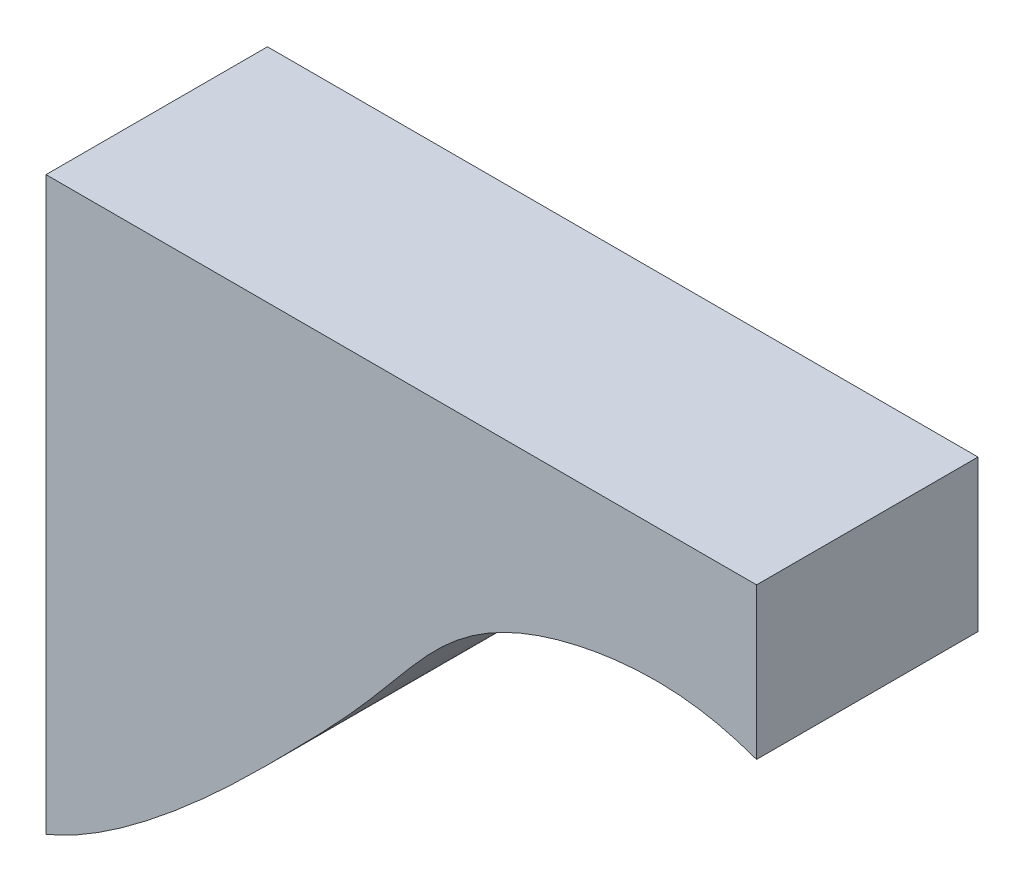
ISO-10303-21;
HEADER;
FILE_DESCRIPTION(('STEP AP214'),'2;1');
FILE_NAME('part.step','',(''),(''),'','','');
FILE_SCHEMA(('AUTOMOTIVE_DESIGN { 1 0 10303 214 1 1 1 1 }'));
ENDSEC;
DATA;
#1=APPLICATION_CONTEXT('core data for automotive mechanical design processes');
#2=APPLICATION_PROTOCOL_DEFINITION('international standard','automotive_design',2000,#1);
#3=PRODUCT_CONTEXT('',#1,'mechanical');
#4=PRODUCT('Part','Part','',(#3));
#5=PRODUCT_RELATED_PRODUCT_CATEGORY('part','',(#4));
#6=PRODUCT_DEFINITION_FORMATION('','',#4);
#7=PRODUCT_DEFINITION_CONTEXT('part definition',#1,'design');
#8=PRODUCT_DEFINITION('design','',#6,#7);
#9=PRODUCT_DEFINITION_SHAPE('','',#8);
#10=(LENGTH_UNIT() NAMED_UNIT(*) SI_UNIT(.MILLI.,.METRE.));
#11=(NAMED_UNIT(*) PLANE_ANGLE_UNIT() SI_UNIT($,.RADIAN.));
#12=(NAMED_UNIT(*) SI_UNIT($,.STERADIAN.) SOLID_ANGLE_UNIT());
#13=UNCERTAINTY_MEASURE_WITH_UNIT(LENGTH_MEASURE(1.E-05),#10,'distance_accuracy_value','');
#14=(GEOMETRIC_REPRESENTATION_CONTEXT(3) GLOBAL_UNCERTAINTY_ASSIGNED_CONTEXT((#13)) GLOBAL_UNIT_ASSIGNED_CONTEXT((#10,
#11,#12)) REPRESENTATION_CONTEXT('',''));
#15=CARTESIAN_POINT('',(0.,0.,0.));
#16=DIRECTION('',(0.,0.,1.));
#17=DIRECTION('',(1.,0.,0.));
#18=AXIS2_PLACEMENT_3D('',#15,#16,#17);
#19=CARTESIAN_POINT('',(64.176185141697,-18.3829097349194,43.9999999999997));
#20=CARTESIAN_POINT('',(64.7902113557796,-18.1318562835224,43.9999999999997));
#21=CARTESIAN_POINT('',(65.3647442195145,-17.8182072919949,43.9999999999997));
#22=CARTESIAN_POINT('',(66.4747387321708,-17.1289828384513,43.9999999999997));
#23=CARTESIAN_POINT('',(67.0092337850599,-16.7518753564826,43.9999999999997));
#24=CARTESIAN_POINT('',(68.054549012157,-15.9601365611778,43.9999999999997));
#25=CARTESIAN_POINT('',(68.5655852799204,-15.5448064595787,43.9999999999997));
#26=CARTESIAN_POINT('',(69.5644663706468,-14.6920847457634,43.9999999999997));
#27=CARTESIAN_POINT('',(70.0531920182059,-14.2539847533171,43.9999999999997));
#28=CARTESIAN_POINT('',(71.4936225253486,-12.9114772371004,43.9999999999997));
#29=CARTESIAN_POINT('',(72.4211412162654,-11.9799830777563,43.9999999999997));
#30=CARTESIAN_POINT('',(73.8008407584314,-10.5732349331057,43.9999999999997));
#31=CARTESIAN_POINT('',(74.2583298655235,-10.1020401053667,43.9999999999997));
#32=CARTESIAN_POINT('',(75.1542571840649,-9.14164237538519,43.9999999999997));
#33=CARTESIAN_POINT('',(75.5923051652214,-8.65209724582154,43.9999999999997));
#34=CARTESIAN_POINT('',(76.4443866195398,-7.65019723113076,43.9999999999997));
#35=CARTESIAN_POINT('',(76.8614369321452,-7.14041319839445,43.9999999999997));
#36=CARTESIAN_POINT('',(77.7187983722306,-6.14370132358863,43.9999999999997));
#37=CARTESIAN_POINT('',(78.1578073934243,-5.65549402550225,43.9999999999997));
#38=CARTESIAN_POINT('',(78.8879346189482,-4.99355104472038,43.9999999999997));
#39=CARTESIAN_POINT('',(79.1428855357567,-4.78427720809741,43.9999999999997));
#40=CARTESIAN_POINT('',(79.679491669474,-4.39196931097297,43.9999999999997));
#41=CARTESIAN_POINT('',(79.9625924755278,-4.20854443955359,43.9999999999997));
#42=CARTESIAN_POINT('',(80.8272197672929,-3.71404185928137,43.9999999999997));
#43=CARTESIAN_POINT('',(81.4311820616806,-3.45243817744652,43.9999999999997));
#44=CARTESIAN_POINT('',(82.3682035422714,-3.13683013825518,43.9999999999997));
#45=CARTESIAN_POINT('',(82.6856860031031,-3.04433386349374,43.9999999999997));
#46=CARTESIAN_POINT('',(83.3300745465412,-2.88262818989416,43.9999999999997));
#47=CARTESIAN_POINT('',(83.6574259546441,-2.81369011634486,43.9999999999997));
#48=CARTESIAN_POINT('',(84.63809497021,-2.64160519636283,43.9999999999997));
#49=CARTESIAN_POINT('',(85.2949649102728,-2.57100859864708,43.9999999999997));
#50=CARTESIAN_POINT('',(86.2861978967168,-2.54975314112215,43.9999999999997));
#51=CARTESIAN_POINT('',(86.6176058838011,-2.55690275973276,43.9999999999997));
#52=CARTESIAN_POINT('',(87.2826533441994,-2.60306254185672,43.9999999999997));
#53=CARTESIAN_POINT('',(87.615772059275,-2.64231877721083,43.9999999999997));
#54=CARTESIAN_POINT('',(88.5950207410823,-2.80727454987168,43.9999999999997));
#55=CARTESIAN_POINT('',(89.2283286747827,-2.98204316226857,43.9999999999997));
#56=CARTESIAN_POINT('',(89.846388359393,-3.20741775553682,43.9999999999997));
#57=B_SPLINE_CURVE_WITH_KNOTS('',3,(#19,#20,#21,#22,#23,#24,#25,#26,#27,#28,#29,#30,#31,#32,#33,
#34,#35,#36,#37,#38,#39,#40,#41,#42,#43,#44,#45,#46,#47,#48,#49,#50,#51,#52,#53,#54,#55,#56),
.UNSPECIFIED.,.F.,.F.,(4,2,2,2,2,2,2,2,2,2,2,2,2,2,2,2,2,2,4),(0.,0.0625000000000001,0.125,
0.1875,0.250000000000001,0.375,0.437499999999999,0.499999999999999,0.562499999999998,
0.624999999999998,0.656249999999997,0.687499999999996,0.749999999999995,0.781249999999994,
0.812499999999994,0.874999999999995,0.906249999999996,0.937499999999998,1.),.UNSPECIFIED.);
#58=DIRECTION('',(0.,0.,1.));
#59=VECTOR('',#58,1.);
#60=SURFACE_OF_LINEAR_EXTRUSION('',#57,#59);
#61=CARTESIAN_POINT('',(89.846388359393,-3.20741775553682,51.9999999999997));
#62=CARTESIAN_POINT('',(89.2283286747827,-2.98204316226857,51.9999999999997));
#63=CARTESIAN_POINT('',(88.5950207410823,-2.80727454987168,51.9999999999997));
#64=CARTESIAN_POINT('',(87.615772059275,-2.64231877721083,51.9999999999997));
#65=CARTESIAN_POINT('',(87.2826533441994,-2.60306254185672,51.9999999999997));
#66=CARTESIAN_POINT('',(86.6176058838011,-2.55690275973276,51.9999999999997));
#67=CARTESIAN_POINT('',(86.2861978967168,-2.54975314112215,51.9999999999997));
#68=CARTESIAN_POINT('',(85.2949649102728,-2.57100859864708,51.9999999999997));
#69=CARTESIAN_POINT('',(84.63809497021,-2.64160519636283,51.9999999999997));
#70=CARTESIAN_POINT('',(83.6574259546441,-2.81369011634486,51.9999999999997));
#71=CARTESIAN_POINT('',(83.3300745465412,-2.88262818989416,51.9999999999997));
#72=CARTESIAN_POINT('',(82.6856860031031,-3.04433386349374,51.9999999999997));
#73=CARTESIAN_POINT('',(82.3682035422714,-3.13683013825518,51.9999999999997));
#74=CARTESIAN_POINT('',(81.4311820616806,-3.45243817744652,51.9999999999997));
#75=CARTESIAN_POINT('',(80.8272197672929,-3.71404185928137,51.9999999999997));
#76=CARTESIAN_POINT('',(79.9625924755278,-4.20854443955359,51.9999999999997));
#77=CARTESIAN_POINT('',(79.679491669474,-4.39196931097297,51.9999999999997));
#78=CARTESIAN_POINT('',(79.1428855357567,-4.78427720809741,51.9999999999997));
#79=CARTESIAN_POINT('',(78.8879346189482,-4.99355104472038,51.9999999999997));
#80=CARTESIAN_POINT('',(78.1578073934243,-5.65549402550225,51.9999999999997));
#81=CARTESIAN_POINT('',(77.7187983722306,-6.14370132358863,51.9999999999997));
#82=CARTESIAN_POINT('',(76.8614369321452,-7.14041319839445,51.9999999999997));
#83=CARTESIAN_POINT('',(76.4443866195398,-7.65019723113076,51.9999999999997));
#84=CARTESIAN_POINT('',(75.5923051652214,-8.65209724582154,51.9999999999997));
#85=CARTESIAN_POINT('',(75.1542571840649,-9.14164237538519,51.9999999999997));
#86=CARTESIAN_POINT('',(74.2583298655235,-10.1020401053667,51.9999999999997));
#87=CARTESIAN_POINT('',(73.8008407584314,-10.5732349331057,51.9999999999997));
#88=CARTESIAN_POINT('',(72.4211412162654,-11.9799830777563,51.9999999999997));
#89=CARTESIAN_POINT('',(71.4936225253486,-12.9114772371004,51.9999999999997));
#90=CARTESIAN_POINT('',(70.0531920182059,-14.2539847533171,51.9999999999997));
#91=CARTESIAN_POINT('',(69.5644663706468,-14.6920847457634,51.9999999999997));
#92=CARTESIAN_POINT('',(68.5655852799204,-15.5448064595787,51.9999999999997));
#93=CARTESIAN_POINT('',(68.054549012157,-15.9601365611778,51.9999999999997));
#94=CARTESIAN_POINT('',(67.0092337850599,-16.7518753564826,51.9999999999997));
#95=CARTESIAN_POINT('',(66.4747387321708,-17.1289828384513,51.9999999999997));
#96=CARTESIAN_POINT('',(65.3647442195145,-17.8182072919949,51.9999999999997));
#97=CARTESIAN_POINT('',(64.7902113557796,-18.1318562835224,51.9999999999997));
#98=CARTESIAN_POINT('',(64.176185141697,-18.3829097349194,51.9999999999997));
#99=B_SPLINE_CURVE_WITH_KNOTS('',3,(#61,#62,#63,#64,#65,#66,#67,#68,#69,#70,#71,#72,#73,#74,#75,
#76,#77,#78,#79,#80,#81,#82,#83,#84,#85,#86,#87,#88,#89,#90,#91,#92,#93,#94,#95,#96,#97,#98),
.UNSPECIFIED.,.F.,.F.,(4,2,2,2,2,2,2,2,2,2,2,2,2,2,2,2,2,2,4),(0.,0.0625000000000023,
0.0937500000000036,0.125000000000005,0.187500000000006,0.218750000000006,0.250000000000005,
0.312500000000004,0.343750000000003,0.375000000000002,0.437500000000002,0.500000000000001,
0.562500000000001,0.625,0.749999999999999,0.8125,0.875,0.9375,1.),.UNSPECIFIED.);
#100=CARTESIAN_POINT('',(64.176185141697,-18.3829097349194,51.9999999999997));
#101=VERTEX_POINT('',#100);
#102=CARTESIAN_POINT('',(89.8463883593922,-3.20741775553971,51.9999999999997));
#103=VERTEX_POINT('',#102);
#104=EDGE_CURVE('E105',#101,#103,#99,.F.);
#105=ORIENTED_EDGE('',*,*,#104,.F.);
#106=DIRECTION('',(0.,0.,1.));
#107=VECTOR('',#106,1.);
#108=CARTESIAN_POINT('',(64.176185141697,-18.3829097349194,43.9999999999997));
#109=LINE('',#108,#107);
#110=CARTESIAN_POINT('',(64.176185141697,-18.3829097349194,43.9999999999997));
#111=VERTEX_POINT('',#110);
#112=EDGE_CURVE('E11',#111,#101,#109,.T.);
#113=ORIENTED_EDGE('',*,*,#112,.F.);
#114=CARTESIAN_POINT('',(64.176185141697,-18.3829097349194,43.9999999999997));
#115=CARTESIAN_POINT('',(64.7902113557796,-18.1318562835224,43.9999999999997));
#116=CARTESIAN_POINT('',(65.3647442195145,-17.8182072919949,43.9999999999997));
#117=CARTESIAN_POINT('',(66.4747387321708,-17.1289828384513,43.9999999999997));
#118=CARTESIAN_POINT('',(67.0092337850599,-16.7518753564826,43.9999999999997));
#119=CARTESIAN_POINT('',(68.054549012157,-15.9601365611778,43.9999999999997));
#120=CARTESIAN_POINT('',(68.5655852799204,-15.5448064595787,43.9999999999997));
#121=CARTESIAN_POINT('',(69.5644663706468,-14.6920847457634,43.9999999999997));
#122=CARTESIAN_POINT('',(70.0531920182059,-14.2539847533171,43.9999999999997));
#123=CARTESIAN_POINT('',(71.4936225253486,-12.9114772371004,43.9999999999997));
#124=CARTESIAN_POINT('',(72.4211412162654,-11.9799830777563,43.9999999999997));
#125=CARTESIAN_POINT('',(73.8008407584314,-10.5732349331057,43.9999999999997));
#126=CARTESIAN_POINT('',(74.2583298655235,-10.1020401053667,43.9999999999997));
#127=CARTESIAN_POINT('',(75.1542571840649,-9.14164237538519,43.9999999999997));
#128=CARTESIAN_POINT('',(75.5923051652214,-8.65209724582154,43.9999999999997));
#129=CARTESIAN_POINT('',(76.4443866195398,-7.65019723113076,43.9999999999997));
#130=CARTESIAN_POINT('',(76.8614369321452,-7.14041319839445,43.9999999999997));
#131=CARTESIAN_POINT('',(77.7187983722306,-6.14370132358863,43.9999999999997));
#132=CARTESIAN_POINT('',(78.1578073934243,-5.65549402550225,43.9999999999997));
#133=CARTESIAN_POINT('',(78.8879346189482,-4.99355104472038,43.9999999999997));
#134=CARTESIAN_POINT('',(79.1428855357567,-4.78427720809741,43.9999999999997));
#135=CARTESIAN_POINT('',(79.679491669474,-4.39196931097297,43.9999999999997));
#136=CARTESIAN_POINT('',(79.9625924755278,-4.20854443955359,43.9999999999997));
#137=CARTESIAN_POINT('',(80.8272197672929,-3.71404185928137,43.9999999999997));
#138=CARTESIAN_POINT('',(81.4311820616806,-3.45243817744652,43.9999999999997));
#139=CARTESIAN_POINT('',(82.3682035422714,-3.13683013825518,43.9999999999997));
#140=CARTESIAN_POINT('',(82.6856860031031,-3.04433386349374,43.9999999999997));
#141=CARTESIAN_POINT('',(83.3300745465412,-2.88262818989416,43.9999999999997));
#142=CARTESIAN_POINT('',(83.6574259546441,-2.81369011634486,43.9999999999997));
#143=CARTESIAN_POINT('',(84.63809497021,-2.64160519636283,43.9999999999997));
#144=CARTESIAN_POINT('',(85.2949649102728,-2.57100859864708,43.9999999999997));
#145=CARTESIAN_POINT('',(86.2861978967168,-2.54975314112215,43.9999999999997));
#146=CARTESIAN_POINT('',(86.6176058838011,-2.55690275973276,43.9999999999997));
#147=CARTESIAN_POINT('',(87.2826533441994,-2.60306254185672,43.9999999999997));
#148=CARTESIAN_POINT('',(87.615772059275,-2.64231877721083,43.9999999999997));
#149=CARTESIAN_POINT('',(88.5950207410823,-2.80727454987168,43.9999999999997));
#150=CARTESIAN_POINT('',(89.2283286747827,-2.98204316226857,43.9999999999997));
#151=CARTESIAN_POINT('',(89.846388359393,-3.20741775553682,43.9999999999997));
#152=B_SPLINE_CURVE_WITH_KNOTS('',3,(#114,#115,#116,#117,#118,#119,#120,#121,#122,#123,#124,
#125,#126,#127,#128,#129,#130,#131,#132,#133,#134,#135,#136,#137,#138,#139,#140,#141,#142,#143,
#144,#145,#146,#147,#148,#149,#150,#151),.UNSPECIFIED.,.F.,.F.,(4,2,2,2,2,2,2,2,2,2,2,2,2,2,2,2,
2,2,4),(0.,0.0625000000000001,0.125,0.1875,0.250000000000001,0.375,0.437499999999999,
0.499999999999999,0.562499999999998,0.624999999999998,0.656249999999997,0.687499999999996,
0.749999999999995,0.781249999999994,0.812499999999994,0.874999999999995,0.906249999999996,
0.937499999999998,1.),.UNSPECIFIED.);
#153=CARTESIAN_POINT('',(89.8463883593922,-3.20741775553971,43.9999999999997));
#154=VERTEX_POINT('',#153);
#155=EDGE_CURVE('E92',#111,#154,#152,.T.);
#156=ORIENTED_EDGE('',*,*,#155,.T.);
#157=DIRECTION('',(0.,0.,1.));
#158=VECTOR('',#157,1.);
#159=CARTESIAN_POINT('',(89.8463883593922,-3.20741775553971,43.9999999999997));
#160=LINE('',#159,#158);
#161=EDGE_CURVE('E75',#154,#103,#160,.T.);
#162=ORIENTED_EDGE('',*,*,#161,.T.);
#163=EDGE_LOOP('',(#105,#113,#156,#162));
#164=FACE_BOUND('',#163,.T.);
#165=ADVANCED_FACE('F30',(#164),#60,.T.);
#166=CARTESIAN_POINT('',(64.176266345034,2.25600000000003,43.9999999999997));
#167=DIRECTION('',(-0.99999999999226,3.93447803403083E-06,0.));
#168=DIRECTION('',(-3.93447803403083E-06,-0.99999999999226,0.));
#169=AXIS2_PLACEMENT_3D('',#166,#167,#168);
#170=PLANE('',#169);
#171=DIRECTION('',(-3.93447803403083E-06,-0.99999999999226,0.));
#172=VECTOR('',#171,1.);
#173=CARTESIAN_POINT('',(64.176266345034,2.25600000000003,51.9999999999997));
#174=LINE('',#173,#172);
#175=CARTESIAN_POINT('',(64.176266345034,2.25600000000003,51.9999999999997));
#176=VERTEX_POINT('',#175);
#177=EDGE_CURVE('E94',#176,#101,#174,.T.);
#178=ORIENTED_EDGE('',*,*,#177,.F.);
#179=DIRECTION('',(0.,0.,1.));
#180=VECTOR('',#179,1.);
#181=CARTESIAN_POINT('',(64.176266345034,2.25600000000003,43.9999999999997));
#182=LINE('',#181,#180);
#183=CARTESIAN_POINT('',(64.176266345034,2.25600000000003,43.9999999999997));
#184=VERTEX_POINT('',#183);
#185=EDGE_CURVE('E41',#184,#176,#182,.T.);
#186=ORIENTED_EDGE('',*,*,#185,.F.);
#187=DIRECTION('',(-3.93447803403083E-06,-0.99999999999226,0.));
#188=VECTOR('',#187,1.);
#189=CARTESIAN_POINT('',(64.176266345034,2.25600000000003,43.9999999999997));
#190=LINE('',#189,#188);
#191=EDGE_CURVE('E89',#184,#111,#190,.T.);
#192=ORIENTED_EDGE('',*,*,#191,.T.);
#193=ORIENTED_EDGE('',*,*,#112,.T.);
#194=EDGE_LOOP('',(#178,#186,#192,#193));
#195=FACE_BOUND('',#194,.T.);
#196=ADVANCED_FACE('F122',(#195),#170,.T.);
#197=CARTESIAN_POINT('',(89.8464697740597,2.25600000000005,43.9999999999997));
#198=DIRECTION('',(0.,1.,0.));
#199=DIRECTION('',(-1.,0.,0.));
#200=AXIS2_PLACEMENT_3D('',#197,#198,#199);
#201=PLANE('',#200);
#202=DIRECTION('',(-1.,0.,0.));
#203=VECTOR('',#202,1.);
#204=CARTESIAN_POINT('',(89.8464697740597,2.25600000000005,51.9999999999997));
#205=LINE('',#204,#203);
#206=CARTESIAN_POINT('',(89.8464697740597,2.25600000000005,51.9999999999997));
#207=VERTEX_POINT('',#206);
#208=EDGE_CURVE('E83',#207,#176,#205,.T.);
#209=ORIENTED_EDGE('',*,*,#208,.F.);
#210=DIRECTION('',(0.,0.,1.));
#211=VECTOR('',#210,1.);
#212=CARTESIAN_POINT('',(89.8464697740597,2.25600000000005,43.9999999999997));
#213=LINE('',#212,#211);
#214=CARTESIAN_POINT('',(89.8464697740597,2.25600000000005,43.9999999999997));
#215=VERTEX_POINT('',#214);
#216=EDGE_CURVE('E78',#215,#207,#213,.T.);
#217=ORIENTED_EDGE('',*,*,#216,.F.);
#218=DIRECTION('',(-1.,0.,0.));
#219=VECTOR('',#218,1.);
#220=CARTESIAN_POINT('',(89.8464697740597,2.25600000000005,43.9999999999997));
#221=LINE('',#220,#219);
#222=EDGE_CURVE('E81',#215,#184,#221,.T.);
#223=ORIENTED_EDGE('',*,*,#222,.T.);
#224=ORIENTED_EDGE('',*,*,#185,.T.);
#225=EDGE_LOOP('',(#209,#217,#223,#224));
#226=FACE_BOUND('',#225,.T.);
#227=ADVANCED_FACE('F80',(#226),#201,.T.);
#228=CARTESIAN_POINT('',(89.8463883593922,-3.20741775553971,43.9999999999997));
#229=DIRECTION('',(0.999999999888968,-1.49017833178616E-05,0.));
#230=DIRECTION('',(1.49017833178616E-05,0.999999999888968,0.));
#231=AXIS2_PLACEMENT_3D('',#228,#229,#230);
#232=PLANE('',#231);
#233=DIRECTION('',(1.49017833178616E-05,0.999999999888968,0.));
#234=VECTOR('',#233,1.);
#235=CARTESIAN_POINT('',(89.8463883593922,-3.20741775553971,51.9999999999997));
#236=LINE('',#235,#234);
#237=EDGE_CURVE('E133',#103,#207,#236,.T.);
#238=ORIENTED_EDGE('',*,*,#237,.F.);
#239=ORIENTED_EDGE('',*,*,#161,.F.);
#240=DIRECTION('',(1.49017833178616E-05,0.999999999888968,0.));
#241=VECTOR('',#240,1.);
#242=CARTESIAN_POINT('',(89.8463883593922,-3.20741775553971,43.9999999999997));
#243=LINE('',#242,#241);
#244=EDGE_CURVE('E88',#154,#215,#243,.T.);
#245=ORIENTED_EDGE('',*,*,#244,.T.);
#246=ORIENTED_EDGE('',*,*,#216,.T.);
#247=EDGE_LOOP('',(#238,#239,#245,#246));
#248=FACE_BOUND('',#247,.T.);
#249=ADVANCED_FACE('F91',(#248),#232,.T.);
#250=CARTESIAN_POINT('',(76.0183458923807,-8.15114723847612,43.9999999999997));
#251=DIRECTION('',(0.,0.,-1.));
#252=DIRECTION('',(-1.,0.,0.));
#253=AXIS2_PLACEMENT_3D('',#250,#251,#252);
#254=PLANE('',#253);
#255=ORIENTED_EDGE('',*,*,#155,.F.);
#256=ORIENTED_EDGE('',*,*,#191,.F.);
#257=ORIENTED_EDGE('',*,*,#222,.F.);
#258=ORIENTED_EDGE('',*,*,#244,.F.);
#259=EDGE_LOOP('',(#255,#256,#257,#258));
#260=FACE_BOUND('',#259,.T.);
#261=ADVANCED_FACE('F87',(#260),#254,.T.);
#262=CARTESIAN_POINT('',(76.0183458923807,-8.15114723847612,51.9999999999997));
#263=DIRECTION('',(0.,0.,-1.));
#264=DIRECTION('',(-1.,0.,0.));
#265=AXIS2_PLACEMENT_3D('',#262,#263,#264);
#266=PLANE('',#265);
#267=ORIENTED_EDGE('',*,*,#104,.T.);
#268=ORIENTED_EDGE('',*,*,#237,.T.);
#269=ORIENTED_EDGE('',*,*,#208,.T.);
#270=ORIENTED_EDGE('',*,*,#177,.T.);
#271=EDGE_LOOP('',(#267,#268,#269,#270));
#272=FACE_BOUND('',#271,.T.);
#273=ADVANCED_FACE('F111',(#272),#266,.F.);
#274=CLOSED_SHELL('',(#165,#196,#227,#249,#261,#273));
#275=MANIFOLD_SOLID_BREP('B2',#274);
#276=ADVANCED_BREP_SHAPE_REPRESENTATION('',(#18,#275),#14);
#277=SHAPE_DEFINITION_REPRESENTATION(#9,#276);
ENDSEC;
END-ISO-10303-21;
